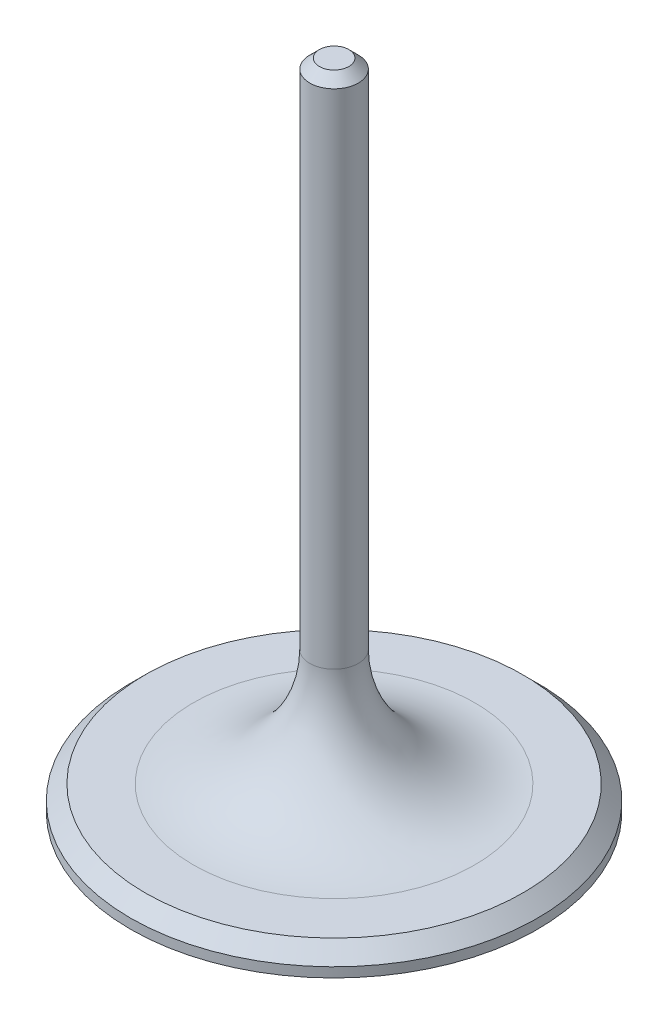
ISO-10303-21;
HEADER;
FILE_DESCRIPTION(('STEP AP214'),'2;1');
FILE_NAME('part.step','',(''),(''),'','','');
FILE_SCHEMA(('AUTOMOTIVE_DESIGN { 1 0 10303 214 1 1 1 1 }'));
ENDSEC;
DATA;
#1=APPLICATION_CONTEXT('core data for automotive mechanical design processes');
#2=APPLICATION_PROTOCOL_DEFINITION('international standard','automotive_design',2000,#1);
#3=PRODUCT_CONTEXT('',#1,'mechanical');
#4=PRODUCT('Part','Part','',(#3));
#5=PRODUCT_RELATED_PRODUCT_CATEGORY('part','',(#4));
#6=PRODUCT_DEFINITION_FORMATION('','',#4);
#7=PRODUCT_DEFINITION_CONTEXT('part definition',#1,'design');
#8=PRODUCT_DEFINITION('design','',#6,#7);
#9=PRODUCT_DEFINITION_SHAPE('','',#8);
#10=(LENGTH_UNIT() NAMED_UNIT(*) SI_UNIT(.MILLI.,.METRE.));
#11=(NAMED_UNIT(*) PLANE_ANGLE_UNIT() SI_UNIT($,.RADIAN.));
#12=(NAMED_UNIT(*) SI_UNIT($,.STERADIAN.) SOLID_ANGLE_UNIT());
#13=UNCERTAINTY_MEASURE_WITH_UNIT(LENGTH_MEASURE(1.E-05),#10,'distance_accuracy_value','');
#14=(GEOMETRIC_REPRESENTATION_CONTEXT(3) GLOBAL_UNCERTAINTY_ASSIGNED_CONTEXT((#13)) GLOBAL_UNIT_ASSIGNED_CONTEXT((#10,
#11,#12)) REPRESENTATION_CONTEXT('',''));
#15=CARTESIAN_POINT('',(0.,0.,0.));
#16=DIRECTION('',(0.,0.,1.));
#17=DIRECTION('',(1.,0.,0.));
#18=AXIS2_PLACEMENT_3D('',#15,#16,#17);
#19=CARTESIAN_POINT('',(0.,91.878860223658,0.));
#20=DIRECTION('',(0.,1.,0.));
#21=DIRECTION('',(0.,0.,1.));
#22=AXIS2_PLACEMENT_3D('',#19,#20,#21);
#23=CYLINDRICAL_SURFACE('',#22,26.67);
#24=CARTESIAN_POINT('',(0.,1.27000000000001,0.));
#25=DIRECTION('',(0.,1.,0.));
#26=DIRECTION('',(0.,0.,1.));
#27=AXIS2_PLACEMENT_3D('',#24,#25,#26);
#28=CIRCLE('',#27,26.67);
#29=CARTESIAN_POINT('',(0.,1.27000000000001,26.67));
#30=VERTEX_POINT('',#29);
#31=EDGE_CURVE('E57',#30,#30,#28,.T.);
#32=ORIENTED_EDGE('',*,*,#31,.F.);
#33=EDGE_LOOP('',(#32));
#34=FACE_BOUND('',#33,.T.);
#35=CARTESIAN_POINT('',(0.,0.,0.));
#36=DIRECTION('',(0.,1.,0.));
#37=DIRECTION('',(0.,0.,1.));
#38=AXIS2_PLACEMENT_3D('',#35,#36,#37);
#39=CIRCLE('',#38,26.67);
#40=CARTESIAN_POINT('',(0.,0.,26.67));
#41=VERTEX_POINT('',#40);
#42=EDGE_CURVE('E76',#41,#41,#39,.T.);
#43=ORIENTED_EDGE('',*,*,#42,.T.);
#44=EDGE_LOOP('',(#43));
#45=FACE_BOUND('',#44,.T.);
#46=ADVANCED_FACE('F43',(#34,#45),#23,.T.);
#47=CARTESIAN_POINT('',(0.,3.18,0.));
#48=DIRECTION('',(0.,-1.,0.));
#49=DIRECTION('',(0.,0.,-1.));
#50=AXIS2_PLACEMENT_3D('',#47,#48,#49);
#51=CONICAL_SURFACE('',#50,24.76,0.785398163397447);
#52=ORIENTED_EDGE('',*,*,#31,.T.);
#53=EDGE_LOOP('',(#52));
#54=FACE_BOUND('',#53,.T.);
#55=CARTESIAN_POINT('',(0.,3.18,0.));
#56=DIRECTION('',(0.,1.,0.));
#57=DIRECTION('',(0.,0.,1.));
#58=AXIS2_PLACEMENT_3D('',#55,#56,#57);
#59=CIRCLE('',#58,24.76);
#60=CARTESIAN_POINT('',(0.,3.18,24.76));
#61=VERTEX_POINT('',#60);
#62=EDGE_CURVE('E62',#61,#61,#59,.T.);
#63=ORIENTED_EDGE('',*,*,#62,.F.);
#64=EDGE_LOOP('',(#63));
#65=FACE_BOUND('',#64,.T.);
#66=ADVANCED_FACE('F94',(#54,#65),#51,.T.);
#67=CARTESIAN_POINT('',(0.,3.18,0.));
#68=DIRECTION('',(0.,1.,0.));
#69=DIRECTION('',(0.,0.,1.));
#70=AXIS2_PLACEMENT_3D('',#67,#68,#69);
#71=PLANE('',#70);
#72=ORIENTED_EDGE('',*,*,#62,.T.);
#73=EDGE_LOOP('',(#72));
#74=FACE_BOUND('',#73,.T.);
#75=CARTESIAN_POINT('',(0.,3.18,0.));
#76=DIRECTION('',(0.,1.,0.));
#77=DIRECTION('',(0.,0.,1.));
#78=AXIS2_PLACEMENT_3D('',#75,#76,#77);
#79=CIRCLE('',#78,18.43);
#80=CARTESIAN_POINT('',(0.,3.18,18.43));
#81=VERTEX_POINT('',#80);
#82=EDGE_CURVE('E68',#81,#81,#79,.T.);
#83=ORIENTED_EDGE('',*,*,#82,.F.);
#84=EDGE_LOOP('',(#83));
#85=FACE_BOUND('',#84,.T.);
#86=ADVANCED_FACE('F99',(#74,#85),#71,.T.);
#87=CARTESIAN_POINT('',(0.,18.43,0.));
#88=DIRECTION('',(0.,1.,0.));
#89=DIRECTION('',(0.,0.,1.));
#90=AXIS2_PLACEMENT_3D('',#87,#88,#89);
#91=TOROIDAL_SURFACE('',#90,18.43,15.25);
#92=ORIENTED_EDGE('',*,*,#82,.T.);
#93=EDGE_LOOP('',(#92));
#94=FACE_BOUND('',#93,.T.);
#95=CARTESIAN_POINT('',(0.,18.43,0.));
#96=DIRECTION('',(0.,1.,0.));
#97=DIRECTION('',(0.,0.,1.));
#98=AXIS2_PLACEMENT_3D('',#95,#96,#97);
#99=CIRCLE('',#98,3.18);
#100=CARTESIAN_POINT('',(0.,18.43,3.18));
#101=VERTEX_POINT('',#100);
#102=EDGE_CURVE('E72',#101,#101,#99,.T.);
#103=ORIENTED_EDGE('',*,*,#102,.F.);
#104=EDGE_LOOP('',(#103));
#105=FACE_BOUND('',#104,.T.);
#106=ADVANCED_FACE('F106',(#94,#105),#91,.F.);
#107=CARTESIAN_POINT('',(0.,91.878860223658,0.));
#108=DIRECTION('',(0.,1.,0.));
#109=DIRECTION('',(0.,0.,1.));
#110=AXIS2_PLACEMENT_3D('',#107,#108,#109);
#111=CYLINDRICAL_SURFACE('',#110,3.18);
#112=CARTESIAN_POINT('',(0.,84.3,0.));
#113=DIRECTION('',(0.,1.,0.));
#114=DIRECTION('',(0.,0.,1.));
#115=AXIS2_PLACEMENT_3D('',#112,#113,#114);
#116=CIRCLE('',#115,3.18);
#117=CARTESIAN_POINT('',(0.,84.3,3.18));
#118=VERTEX_POINT('',#117);
#119=EDGE_CURVE('E10',#118,#118,#116,.F.);
#120=ORIENTED_EDGE('',*,*,#119,.T.);
#121=EDGE_LOOP('',(#120));
#122=FACE_BOUND('',#121,.T.);
#123=ORIENTED_EDGE('',*,*,#102,.T.);
#124=EDGE_LOOP('',(#123));
#125=FACE_BOUND('',#124,.T.);
#126=ADVANCED_FACE('F91',(#122,#125),#111,.T.);
#127=CARTESIAN_POINT('',(-3.73347404703939E-13,85.55,0.));
#128=DIRECTION('',(0.,1.,0.));
#129=DIRECTION('',(0.,0.,1.));
#130=AXIS2_PLACEMENT_3D('',#127,#128,#129);
#131=PLANE('',#130);
#132=CARTESIAN_POINT('',(0.,85.55,0.));
#133=DIRECTION('',(0.,1.,0.));
#134=DIRECTION('',(0.,0.,1.));
#135=AXIS2_PLACEMENT_3D('',#132,#133,#134);
#136=CIRCLE('',#135,1.92999999999999);
#137=CARTESIAN_POINT('',(0.,85.55,1.92999999999999));
#138=VERTEX_POINT('',#137);
#139=EDGE_CURVE('E52',#138,#138,#136,.T.);
#140=ORIENTED_EDGE('',*,*,#139,.T.);
#141=EDGE_LOOP('',(#140));
#142=FACE_BOUND('',#141,.T.);
#143=ADVANCED_FACE('F84',(#142),#131,.T.);
#144=CARTESIAN_POINT('',(0.,0.,0.));
#145=DIRECTION('',(0.,1.,0.));
#146=DIRECTION('',(0.,0.,1.));
#147=AXIS2_PLACEMENT_3D('',#144,#145,#146);
#148=PLANE('',#147);
#149=ORIENTED_EDGE('',*,*,#42,.F.);
#150=EDGE_LOOP('',(#149));
#151=FACE_BOUND('',#150,.T.);
#152=ADVANCED_FACE('F82',(#151),#148,.F.);
#153=CARTESIAN_POINT('',(0.,85.55,0.));
#154=DIRECTION('',(0.,-1.,0.));
#155=DIRECTION('',(0.,0.,-1.));
#156=AXIS2_PLACEMENT_3D('',#153,#154,#155);
#157=CONICAL_SURFACE('',#156,1.92999999999999,0.785398163397446);
#158=ORIENTED_EDGE('',*,*,#119,.F.);
#159=EDGE_LOOP('',(#158));
#160=FACE_BOUND('',#159,.T.);
#161=ORIENTED_EDGE('',*,*,#139,.F.);
#162=EDGE_LOOP('',(#161));
#163=FACE_BOUND('',#162,.T.);
#164=ADVANCED_FACE('F46',(#160,#163),#157,.T.);
#165=CLOSED_SHELL('',(#46,#66,#86,#106,#126,#143,#152,#164));
#166=MANIFOLD_SOLID_BREP('B2',#165);
#167=ADVANCED_BREP_SHAPE_REPRESENTATION('',(#18,#166),#14);
#168=SHAPE_DEFINITION_REPRESENTATION(#9,#167);
ENDSEC;
END-ISO-10303-21;
